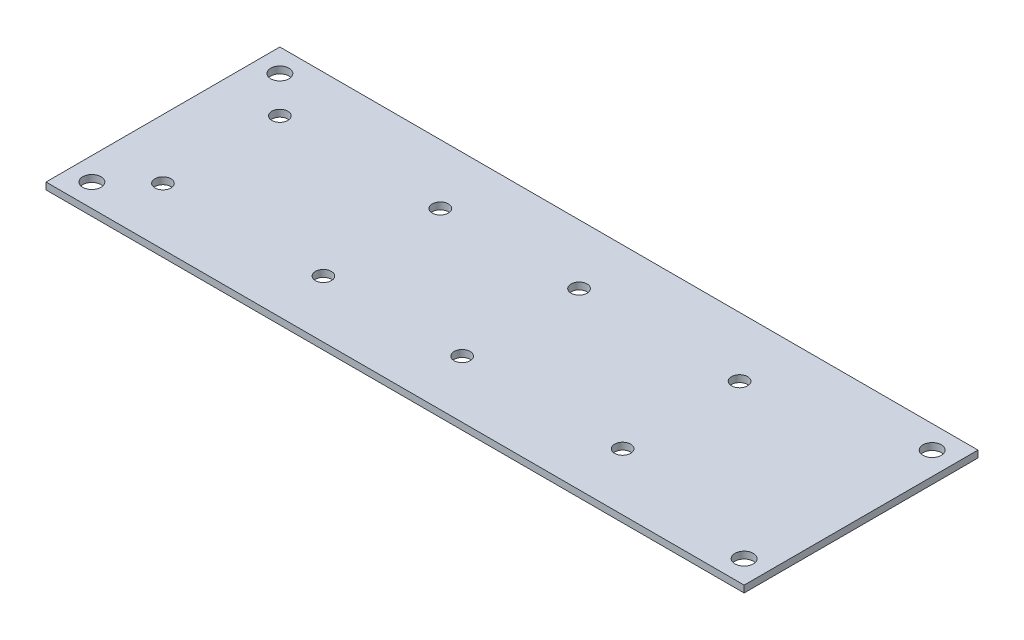
ISO-10303-21;
HEADER;
FILE_DESCRIPTION(('STEP AP214'),'2;1');
FILE_NAME('part.step','',(''),(''),'','','');
FILE_SCHEMA(('AUTOMOTIVE_DESIGN { 1 0 10303 214 1 1 1 1 }'));
ENDSEC;
DATA;
#1=APPLICATION_CONTEXT('core data for automotive mechanical design processes');
#2=APPLICATION_PROTOCOL_DEFINITION('international standard','automotive_design',2000,#1);
#3=PRODUCT_CONTEXT('',#1,'mechanical');
#4=PRODUCT('Part','Part','',(#3));
#5=PRODUCT_RELATED_PRODUCT_CATEGORY('part','',(#4));
#6=PRODUCT_DEFINITION_FORMATION('','',#4);
#7=PRODUCT_DEFINITION_CONTEXT('part definition',#1,'design');
#8=PRODUCT_DEFINITION('design','',#6,#7);
#9=PRODUCT_DEFINITION_SHAPE('','',#8);
#10=(LENGTH_UNIT() NAMED_UNIT(*) SI_UNIT(.MILLI.,.METRE.));
#11=(NAMED_UNIT(*) PLANE_ANGLE_UNIT() SI_UNIT($,.RADIAN.));
#12=(NAMED_UNIT(*) SI_UNIT($,.STERADIAN.) SOLID_ANGLE_UNIT());
#13=UNCERTAINTY_MEASURE_WITH_UNIT(LENGTH_MEASURE(1.E-05),#10,'distance_accuracy_value','');
#14=(GEOMETRIC_REPRESENTATION_CONTEXT(3) GLOBAL_UNCERTAINTY_ASSIGNED_CONTEXT((#13)) GLOBAL_UNIT_ASSIGNED_CONTEXT((#10,
#11,#12)) REPRESENTATION_CONTEXT('',''));
#15=CARTESIAN_POINT('',(0.,0.,0.));
#16=DIRECTION('',(0.,0.,1.));
#17=DIRECTION('',(1.,0.,0.));
#18=AXIS2_PLACEMENT_3D('',#15,#16,#17);
#19=CARTESIAN_POINT('',(76.125,-1.5,25.5));
#20=DIRECTION('',(1.,0.,0.));
#21=DIRECTION('',(0.,0.,-1.));
#22=AXIS2_PLACEMENT_3D('',#19,#20,#21);
#23=PLANE('',#22);
#24=DIRECTION('',(0.,0.,-1.));
#25=VECTOR('',#24,1.);
#26=CARTESIAN_POINT('',(76.125,0.,25.5));
#27=LINE('',#26,#25);
#28=CARTESIAN_POINT('',(76.125,0.,25.5));
#29=VERTEX_POINT('',#28);
#30=CARTESIAN_POINT('',(76.125,0.,-25.5));
#31=VERTEX_POINT('',#30);
#32=EDGE_CURVE('E102',#29,#31,#27,.T.);
#33=ORIENTED_EDGE('',*,*,#32,.F.);
#34=DIRECTION('',(0.,1.,0.));
#35=VECTOR('',#34,1.);
#36=CARTESIAN_POINT('',(76.125,-1.5,25.5));
#37=LINE('',#36,#35);
#38=CARTESIAN_POINT('',(76.125,-1.5,25.5));
#39=VERTEX_POINT('',#38);
#40=EDGE_CURVE('E11',#39,#29,#37,.T.);
#41=ORIENTED_EDGE('',*,*,#40,.F.);
#42=DIRECTION('',(0.,0.,-1.));
#43=VECTOR('',#42,1.);
#44=CARTESIAN_POINT('',(76.125,-1.5,25.5));
#45=LINE('',#44,#43);
#46=CARTESIAN_POINT('',(76.125,-1.5,-25.5));
#47=VERTEX_POINT('',#46);
#48=EDGE_CURVE('E95',#39,#47,#45,.T.);
#49=ORIENTED_EDGE('',*,*,#48,.T.);
#50=DIRECTION('',(0.,1.,0.));
#51=VECTOR('',#50,1.);
#52=CARTESIAN_POINT('',(76.125,-1.5,-25.5));
#53=LINE('',#52,#51);
#54=EDGE_CURVE('E40',#47,#31,#53,.T.);
#55=ORIENTED_EDGE('',*,*,#54,.T.);
#56=EDGE_LOOP('',(#33,#41,#49,#55));
#57=FACE_BOUND('',#56,.T.);
#58=ADVANCED_FACE('F37',(#57),#23,.T.);
#59=CARTESIAN_POINT('',(-76.125,-1.5,25.5));
#60=DIRECTION('',(0.,0.,1.));
#61=DIRECTION('',(1.,0.,0.));
#62=AXIS2_PLACEMENT_3D('',#59,#60,#61);
#63=PLANE('',#62);
#64=DIRECTION('',(1.,0.,0.));
#65=VECTOR('',#64,1.);
#66=CARTESIAN_POINT('',(-76.125,0.,25.5));
#67=LINE('',#66,#65);
#68=CARTESIAN_POINT('',(-76.125,0.,25.5));
#69=VERTEX_POINT('',#68);
#70=EDGE_CURVE('E97',#69,#29,#67,.T.);
#71=ORIENTED_EDGE('',*,*,#70,.F.);
#72=DIRECTION('',(0.,1.,0.));
#73=VECTOR('',#72,1.);
#74=CARTESIAN_POINT('',(-76.125,-1.5,25.5));
#75=LINE('',#74,#73);
#76=CARTESIAN_POINT('',(-76.125,-1.5,25.5));
#77=VERTEX_POINT('',#76);
#78=EDGE_CURVE('E46',#77,#69,#75,.T.);
#79=ORIENTED_EDGE('',*,*,#78,.F.);
#80=DIRECTION('',(1.,0.,0.));
#81=VECTOR('',#80,1.);
#82=CARTESIAN_POINT('',(-76.125,-1.5,25.5));
#83=LINE('',#82,#81);
#84=EDGE_CURVE('E92',#77,#39,#83,.T.);
#85=ORIENTED_EDGE('',*,*,#84,.T.);
#86=ORIENTED_EDGE('',*,*,#40,.T.);
#87=EDGE_LOOP('',(#71,#79,#85,#86));
#88=FACE_BOUND('',#87,.T.);
#89=ADVANCED_FACE('F113',(#88),#63,.T.);
#90=CARTESIAN_POINT('',(-76.125,-1.5,25.5));
#91=DIRECTION('',(-1.,0.,0.));
#92=DIRECTION('',(0.,0.,1.));
#93=AXIS2_PLACEMENT_3D('',#90,#91,#92);
#94=PLANE('',#93);
#95=DIRECTION('',(0.,0.,1.));
#96=VECTOR('',#95,1.);
#97=CARTESIAN_POINT('',(-76.125,0.,25.5));
#98=LINE('',#97,#96);
#99=CARTESIAN_POINT('',(-76.125,0.,-25.5));
#100=VERTEX_POINT('',#99);
#101=EDGE_CURVE('E87',#100,#69,#98,.T.);
#102=ORIENTED_EDGE('',*,*,#101,.F.);
#103=DIRECTION('',(0.,1.,0.));
#104=VECTOR('',#103,1.);
#105=CARTESIAN_POINT('',(-76.125,-1.5,-25.5));
#106=LINE('',#105,#104);
#107=CARTESIAN_POINT('',(-76.125,-1.5,-25.5));
#108=VERTEX_POINT('',#107);
#109=EDGE_CURVE('E82',#108,#100,#106,.T.);
#110=ORIENTED_EDGE('',*,*,#109,.F.);
#111=DIRECTION('',(0.,0.,1.));
#112=VECTOR('',#111,1.);
#113=CARTESIAN_POINT('',(-76.125,-1.5,25.5));
#114=LINE('',#113,#112);
#115=EDGE_CURVE('E85',#108,#77,#114,.T.);
#116=ORIENTED_EDGE('',*,*,#115,.T.);
#117=ORIENTED_EDGE('',*,*,#78,.T.);
#118=EDGE_LOOP('',(#102,#110,#116,#117));
#119=FACE_BOUND('',#118,.T.);
#120=ADVANCED_FACE('F84',(#119),#94,.T.);
#121=CARTESIAN_POINT('',(-76.125,-1.5,-25.5));
#122=DIRECTION('',(0.,0.,-1.));
#123=DIRECTION('',(-1.,0.,0.));
#124=AXIS2_PLACEMENT_3D('',#121,#122,#123);
#125=PLANE('',#124);
#126=DIRECTION('',(-1.,0.,0.));
#127=VECTOR('',#126,1.);
#128=CARTESIAN_POINT('',(-76.125,0.,-25.5));
#129=LINE('',#128,#127);
#130=EDGE_CURVE('E105',#31,#100,#129,.T.);
#131=ORIENTED_EDGE('',*,*,#130,.F.);
#132=ORIENTED_EDGE('',*,*,#54,.F.);
#133=DIRECTION('',(-1.,0.,0.));
#134=VECTOR('',#133,1.);
#135=CARTESIAN_POINT('',(-76.125,-1.5,-25.5));
#136=LINE('',#135,#134);
#137=EDGE_CURVE('E91',#47,#108,#136,.T.);
#138=ORIENTED_EDGE('',*,*,#137,.T.);
#139=ORIENTED_EDGE('',*,*,#109,.T.);
#140=EDGE_LOOP('',(#131,#132,#138,#139));
#141=FACE_BOUND('',#140,.T.);
#142=ADVANCED_FACE('F94',(#141),#125,.T.);
#143=CARTESIAN_POINT('',(0.,-1.5,0.));
#144=DIRECTION('',(0.,-1.,0.));
#145=DIRECTION('',(0.,0.,-1.));
#146=AXIS2_PLACEMENT_3D('',#143,#144,#145);
#147=PLANE('',#146);
#148=CARTESIAN_POINT('',(-71.125,-1.5,20.5));
#149=DIRECTION('',(0.,1.,0.));
#150=DIRECTION('',(0.,0.,1.));
#151=AXIS2_PLACEMENT_3D('',#148,#149,#150);
#152=CIRCLE('',#151,2.);
#153=CARTESIAN_POINT('',(-71.125,-1.5,22.5));
#154=VERTEX_POINT('',#153);
#155=EDGE_CURVE('E186',#154,#154,#152,.T.);
#156=ORIENTED_EDGE('',*,*,#155,.T.);
#157=EDGE_LOOP('',(#156));
#158=FACE_BOUND('',#157,.T.);
#159=CARTESIAN_POINT('',(-71.125,-1.5,-20.5));
#160=DIRECTION('',(0.,1.,0.));
#161=DIRECTION('',(0.,0.,1.));
#162=AXIS2_PLACEMENT_3D('',#159,#160,#161);
#163=CIRCLE('',#162,2.);
#164=CARTESIAN_POINT('',(-71.125,-1.5,-18.5));
#165=VERTEX_POINT('',#164);
#166=EDGE_CURVE('E194',#165,#165,#163,.T.);
#167=ORIENTED_EDGE('',*,*,#166,.T.);
#168=EDGE_LOOP('',(#167));
#169=FACE_BOUND('',#168,.T.);
#170=CARTESIAN_POINT('',(71.125,-1.5,20.5));
#171=DIRECTION('',(0.,1.,0.));
#172=DIRECTION('',(0.,0.,1.));
#173=AXIS2_PLACEMENT_3D('',#170,#171,#172);
#174=CIRCLE('',#173,2.);
#175=CARTESIAN_POINT('',(71.125,-1.5,22.5));
#176=VERTEX_POINT('',#175);
#177=EDGE_CURVE('E200',#176,#176,#174,.T.);
#178=ORIENTED_EDGE('',*,*,#177,.T.);
#179=EDGE_LOOP('',(#178));
#180=FACE_BOUND('',#179,.T.);
#181=CARTESIAN_POINT('',(71.125,-1.5,-20.5));
#182=DIRECTION('',(0.,1.,0.));
#183=DIRECTION('',(0.,0.,1.));
#184=AXIS2_PLACEMENT_3D('',#181,#182,#183);
#185=CIRCLE('',#184,2.);
#186=CARTESIAN_POINT('',(71.125,-1.5,-18.5));
#187=VERTEX_POINT('',#186);
#188=EDGE_CURVE('E206',#187,#187,#185,.T.);
#189=ORIENTED_EDGE('',*,*,#188,.T.);
#190=EDGE_LOOP('',(#189));
#191=FACE_BOUND('',#190,.T.);
#192=CARTESIAN_POINT('',(2.125,-1.5,13.));
#193=DIRECTION('',(0.,1.,0.));
#194=DIRECTION('',(0.,0.,1.));
#195=AXIS2_PLACEMENT_3D('',#192,#193,#194);
#196=CIRCLE('',#195,1.75);
#197=CARTESIAN_POINT('',(2.125,-1.5,14.75));
#198=VERTEX_POINT('',#197);
#199=EDGE_CURVE('E212',#198,#198,#196,.T.);
#200=ORIENTED_EDGE('',*,*,#199,.T.);
#201=EDGE_LOOP('',(#200));
#202=FACE_BOUND('',#201,.T.);
#203=CARTESIAN_POINT('',(37.125,-1.5,13.));
#204=DIRECTION('',(0.,1.,0.));
#205=DIRECTION('',(0.,0.,1.));
#206=AXIS2_PLACEMENT_3D('',#203,#204,#205);
#207=CIRCLE('',#206,1.75);
#208=CARTESIAN_POINT('',(37.125,-1.5,14.75));
#209=VERTEX_POINT('',#208);
#210=EDGE_CURVE('E218',#209,#209,#207,.T.);
#211=ORIENTED_EDGE('',*,*,#210,.T.);
#212=EDGE_LOOP('',(#211));
#213=FACE_BOUND('',#212,.T.);
#214=CARTESIAN_POINT('',(37.125,-1.5,-12.5));
#215=DIRECTION('',(0.,1.,0.));
#216=DIRECTION('',(0.,0.,1.));
#217=AXIS2_PLACEMENT_3D('',#214,#215,#216);
#218=CIRCLE('',#217,1.75);
#219=CARTESIAN_POINT('',(37.125,-1.5,-10.75));
#220=VERTEX_POINT('',#219);
#221=EDGE_CURVE('E224',#220,#220,#218,.T.);
#222=ORIENTED_EDGE('',*,*,#221,.T.);
#223=EDGE_LOOP('',(#222));
#224=FACE_BOUND('',#223,.T.);
#225=CARTESIAN_POINT('',(2.125,-1.5,-12.5));
#226=DIRECTION('',(0.,1.,0.));
#227=DIRECTION('',(0.,0.,1.));
#228=AXIS2_PLACEMENT_3D('',#225,#226,#227);
#229=CIRCLE('',#228,1.75);
#230=CARTESIAN_POINT('',(2.125,-1.5,-10.75));
#231=VERTEX_POINT('',#230);
#232=EDGE_CURVE('E230',#231,#231,#229,.T.);
#233=ORIENTED_EDGE('',*,*,#232,.T.);
#234=EDGE_LOOP('',(#233));
#235=FACE_BOUND('',#234,.T.);
#236=CARTESIAN_POINT('',(-28.125,-1.5,13.));
#237=DIRECTION('',(0.,1.,0.));
#238=DIRECTION('',(0.,0.,1.));
#239=AXIS2_PLACEMENT_3D('',#236,#237,#238);
#240=CIRCLE('',#239,1.75);
#241=CARTESIAN_POINT('',(-28.125,-1.5,14.75));
#242=VERTEX_POINT('',#241);
#243=EDGE_CURVE('E236',#242,#242,#240,.T.);
#244=ORIENTED_EDGE('',*,*,#243,.T.);
#245=EDGE_LOOP('',(#244));
#246=FACE_BOUND('',#245,.T.);
#247=CARTESIAN_POINT('',(-28.125,-1.5,-12.5));
#248=DIRECTION('',(0.,1.,0.));
#249=DIRECTION('',(0.,0.,1.));
#250=AXIS2_PLACEMENT_3D('',#247,#248,#249);
#251=CIRCLE('',#250,1.75);
#252=CARTESIAN_POINT('',(-28.125,-1.5,-10.75));
#253=VERTEX_POINT('',#252);
#254=EDGE_CURVE('E242',#253,#253,#251,.T.);
#255=ORIENTED_EDGE('',*,*,#254,.T.);
#256=EDGE_LOOP('',(#255));
#257=FACE_BOUND('',#256,.T.);
#258=CARTESIAN_POINT('',(-63.125,-1.5,13.));
#259=DIRECTION('',(0.,1.,0.));
#260=DIRECTION('',(0.,0.,1.));
#261=AXIS2_PLACEMENT_3D('',#258,#259,#260);
#262=CIRCLE('',#261,1.75);
#263=CARTESIAN_POINT('',(-63.125,-1.5,14.75));
#264=VERTEX_POINT('',#263);
#265=EDGE_CURVE('E248',#264,#264,#262,.T.);
#266=ORIENTED_EDGE('',*,*,#265,.T.);
#267=EDGE_LOOP('',(#266));
#268=FACE_BOUND('',#267,.T.);
#269=CARTESIAN_POINT('',(-63.125,-1.5,-12.5));
#270=DIRECTION('',(0.,1.,0.));
#271=DIRECTION('',(0.,0.,1.));
#272=AXIS2_PLACEMENT_3D('',#269,#270,#271);
#273=CIRCLE('',#272,1.75);
#274=CARTESIAN_POINT('',(-63.125,-1.5,-10.75));
#275=VERTEX_POINT('',#274);
#276=EDGE_CURVE('E106',#275,#275,#273,.T.);
#277=ORIENTED_EDGE('',*,*,#276,.T.);
#278=EDGE_LOOP('',(#277));
#279=FACE_BOUND('',#278,.T.);
#280=ORIENTED_EDGE('',*,*,#48,.F.);
#281=ORIENTED_EDGE('',*,*,#84,.F.);
#282=ORIENTED_EDGE('',*,*,#115,.F.);
#283=ORIENTED_EDGE('',*,*,#137,.F.);
#284=EDGE_LOOP('',(#280,#281,#282,#283));
#285=FACE_BOUND('',#284,.T.);
#286=ADVANCED_FACE('F90',(#158,#169,#180,#191,#202,#213,#224,#235,#246,#257,#268,#279,#285),
#147,.T.);
#287=CARTESIAN_POINT('',(0.,0.,0.));
#288=DIRECTION('',(0.,-1.,0.));
#289=DIRECTION('',(0.,0.,-1.));
#290=AXIS2_PLACEMENT_3D('',#287,#288,#289);
#291=PLANE('',#290);
#292=CARTESIAN_POINT('',(-71.125,0.,20.5));
#293=DIRECTION('',(0.,1.,0.));
#294=DIRECTION('',(0.,0.,1.));
#295=AXIS2_PLACEMENT_3D('',#292,#293,#294);
#296=CIRCLE('',#295,2.);
#297=CARTESIAN_POINT('',(-71.125,0.,22.5));
#298=VERTEX_POINT('',#297);
#299=EDGE_CURVE('E189',#298,#298,#296,.T.);
#300=ORIENTED_EDGE('',*,*,#299,.F.);
#301=EDGE_LOOP('',(#300));
#302=FACE_BOUND('',#301,.T.);
#303=CARTESIAN_POINT('',(-71.125,0.,-20.5));
#304=DIRECTION('',(0.,1.,0.));
#305=DIRECTION('',(0.,0.,1.));
#306=AXIS2_PLACEMENT_3D('',#303,#304,#305);
#307=CIRCLE('',#306,2.);
#308=CARTESIAN_POINT('',(-71.125,0.,-18.5));
#309=VERTEX_POINT('',#308);
#310=EDGE_CURVE('E191',#309,#309,#307,.T.);
#311=ORIENTED_EDGE('',*,*,#310,.F.);
#312=EDGE_LOOP('',(#311));
#313=FACE_BOUND('',#312,.T.);
#314=CARTESIAN_POINT('',(71.125,0.,20.5));
#315=DIRECTION('',(0.,1.,0.));
#316=DIRECTION('',(0.,0.,1.));
#317=AXIS2_PLACEMENT_3D('',#314,#315,#316);
#318=CIRCLE('',#317,2.);
#319=CARTESIAN_POINT('',(71.125,0.,22.5));
#320=VERTEX_POINT('',#319);
#321=EDGE_CURVE('E197',#320,#320,#318,.T.);
#322=ORIENTED_EDGE('',*,*,#321,.F.);
#323=EDGE_LOOP('',(#322));
#324=FACE_BOUND('',#323,.T.);
#325=CARTESIAN_POINT('',(71.125,0.,-20.5));
#326=DIRECTION('',(0.,1.,0.));
#327=DIRECTION('',(0.,0.,1.));
#328=AXIS2_PLACEMENT_3D('',#325,#326,#327);
#329=CIRCLE('',#328,2.);
#330=CARTESIAN_POINT('',(71.125,0.,-18.5));
#331=VERTEX_POINT('',#330);
#332=EDGE_CURVE('E203',#331,#331,#329,.T.);
#333=ORIENTED_EDGE('',*,*,#332,.F.);
#334=EDGE_LOOP('',(#333));
#335=FACE_BOUND('',#334,.T.);
#336=CARTESIAN_POINT('',(2.125,0.,13.));
#337=DIRECTION('',(0.,1.,0.));
#338=DIRECTION('',(0.,0.,1.));
#339=AXIS2_PLACEMENT_3D('',#336,#337,#338);
#340=CIRCLE('',#339,1.75);
#341=CARTESIAN_POINT('',(2.125,0.,14.75));
#342=VERTEX_POINT('',#341);
#343=EDGE_CURVE('E209',#342,#342,#340,.T.);
#344=ORIENTED_EDGE('',*,*,#343,.F.);
#345=EDGE_LOOP('',(#344));
#346=FACE_BOUND('',#345,.T.);
#347=CARTESIAN_POINT('',(37.125,0.,13.));
#348=DIRECTION('',(0.,1.,0.));
#349=DIRECTION('',(0.,0.,1.));
#350=AXIS2_PLACEMENT_3D('',#347,#348,#349);
#351=CIRCLE('',#350,1.75);
#352=CARTESIAN_POINT('',(37.125,0.,14.75));
#353=VERTEX_POINT('',#352);
#354=EDGE_CURVE('E215',#353,#353,#351,.T.);
#355=ORIENTED_EDGE('',*,*,#354,.F.);
#356=EDGE_LOOP('',(#355));
#357=FACE_BOUND('',#356,.T.);
#358=CARTESIAN_POINT('',(37.125,0.,-12.5));
#359=DIRECTION('',(0.,1.,0.));
#360=DIRECTION('',(0.,0.,1.));
#361=AXIS2_PLACEMENT_3D('',#358,#359,#360);
#362=CIRCLE('',#361,1.75);
#363=CARTESIAN_POINT('',(37.125,0.,-10.75));
#364=VERTEX_POINT('',#363);
#365=EDGE_CURVE('E221',#364,#364,#362,.T.);
#366=ORIENTED_EDGE('',*,*,#365,.F.);
#367=EDGE_LOOP('',(#366));
#368=FACE_BOUND('',#367,.T.);
#369=CARTESIAN_POINT('',(2.125,0.,-12.5));
#370=DIRECTION('',(0.,1.,0.));
#371=DIRECTION('',(0.,0.,1.));
#372=AXIS2_PLACEMENT_3D('',#369,#370,#371);
#373=CIRCLE('',#372,1.75);
#374=CARTESIAN_POINT('',(2.125,0.,-10.75));
#375=VERTEX_POINT('',#374);
#376=EDGE_CURVE('E227',#375,#375,#373,.T.);
#377=ORIENTED_EDGE('',*,*,#376,.F.);
#378=EDGE_LOOP('',(#377));
#379=FACE_BOUND('',#378,.T.);
#380=CARTESIAN_POINT('',(-28.125,0.,13.));
#381=DIRECTION('',(0.,1.,0.));
#382=DIRECTION('',(0.,0.,1.));
#383=AXIS2_PLACEMENT_3D('',#380,#381,#382);
#384=CIRCLE('',#383,1.75);
#385=CARTESIAN_POINT('',(-28.125,0.,14.75));
#386=VERTEX_POINT('',#385);
#387=EDGE_CURVE('E233',#386,#386,#384,.T.);
#388=ORIENTED_EDGE('',*,*,#387,.F.);
#389=EDGE_LOOP('',(#388));
#390=FACE_BOUND('',#389,.T.);
#391=CARTESIAN_POINT('',(-28.125,0.,-12.5));
#392=DIRECTION('',(0.,1.,0.));
#393=DIRECTION('',(0.,0.,1.));
#394=AXIS2_PLACEMENT_3D('',#391,#392,#393);
#395=CIRCLE('',#394,1.75);
#396=CARTESIAN_POINT('',(-28.125,0.,-10.75));
#397=VERTEX_POINT('',#396);
#398=EDGE_CURVE('E239',#397,#397,#395,.T.);
#399=ORIENTED_EDGE('',*,*,#398,.F.);
#400=EDGE_LOOP('',(#399));
#401=FACE_BOUND('',#400,.T.);
#402=CARTESIAN_POINT('',(-63.125,0.,13.));
#403=DIRECTION('',(0.,1.,0.));
#404=DIRECTION('',(0.,0.,1.));
#405=AXIS2_PLACEMENT_3D('',#402,#403,#404);
#406=CIRCLE('',#405,1.75);
#407=CARTESIAN_POINT('',(-63.125,0.,14.75));
#408=VERTEX_POINT('',#407);
#409=EDGE_CURVE('E245',#408,#408,#406,.T.);
#410=ORIENTED_EDGE('',*,*,#409,.F.);
#411=EDGE_LOOP('',(#410));
#412=FACE_BOUND('',#411,.T.);
#413=CARTESIAN_POINT('',(-63.125,0.,-12.5));
#414=DIRECTION('',(0.,1.,0.));
#415=DIRECTION('',(0.,0.,1.));
#416=AXIS2_PLACEMENT_3D('',#413,#414,#415);
#417=CIRCLE('',#416,1.75);
#418=CARTESIAN_POINT('',(-63.125,0.,-10.75));
#419=VERTEX_POINT('',#418);
#420=EDGE_CURVE('E251',#419,#419,#417,.T.);
#421=ORIENTED_EDGE('',*,*,#420,.F.);
#422=EDGE_LOOP('',(#421));
#423=FACE_BOUND('',#422,.T.);
#424=ORIENTED_EDGE('',*,*,#32,.T.);
#425=ORIENTED_EDGE('',*,*,#130,.T.);
#426=ORIENTED_EDGE('',*,*,#101,.T.);
#427=ORIENTED_EDGE('',*,*,#70,.T.);
#428=EDGE_LOOP('',(#424,#425,#426,#427));
#429=FACE_BOUND('',#428,.T.);
#430=ADVANCED_FACE('F112',(#302,#313,#324,#335,#346,#357,#368,#379,#390,#401,#412,#423,#429),
#291,.F.);
#431=CARTESIAN_POINT('',(-63.125,-1.5,-12.5));
#432=DIRECTION('',(0.,1.,0.));
#433=DIRECTION('',(0.,0.,1.));
#434=AXIS2_PLACEMENT_3D('',#431,#432,#433);
#435=CYLINDRICAL_SURFACE('',#434,1.75);
#436=ORIENTED_EDGE('',*,*,#276,.F.);
#437=EDGE_LOOP('',(#436));
#438=FACE_BOUND('',#437,.T.);
#439=ORIENTED_EDGE('',*,*,#420,.T.);
#440=EDGE_LOOP('',(#439));
#441=FACE_BOUND('',#440,.T.);
#442=ADVANCED_FACE('F131',(#438,#441),#435,.F.);
#443=CARTESIAN_POINT('',(-63.125,-1.5,13.));
#444=DIRECTION('',(0.,1.,0.));
#445=DIRECTION('',(0.,0.,1.));
#446=AXIS2_PLACEMENT_3D('',#443,#444,#445);
#447=CYLINDRICAL_SURFACE('',#446,1.75);
#448=ORIENTED_EDGE('',*,*,#265,.F.);
#449=EDGE_LOOP('',(#448));
#450=FACE_BOUND('',#449,.T.);
#451=ORIENTED_EDGE('',*,*,#409,.T.);
#452=EDGE_LOOP('',(#451));
#453=FACE_BOUND('',#452,.T.);
#454=ADVANCED_FACE('F138',(#450,#453),#447,.F.);
#455=CARTESIAN_POINT('',(-28.125,-1.5,-12.5));
#456=DIRECTION('',(0.,1.,0.));
#457=DIRECTION('',(0.,0.,1.));
#458=AXIS2_PLACEMENT_3D('',#455,#456,#457);
#459=CYLINDRICAL_SURFACE('',#458,1.75);
#460=ORIENTED_EDGE('',*,*,#254,.F.);
#461=EDGE_LOOP('',(#460));
#462=FACE_BOUND('',#461,.T.);
#463=ORIENTED_EDGE('',*,*,#398,.T.);
#464=EDGE_LOOP('',(#463));
#465=FACE_BOUND('',#464,.T.);
#466=ADVANCED_FACE('F142',(#462,#465),#459,.F.);
#467=CARTESIAN_POINT('',(-28.125,-1.5,13.));
#468=DIRECTION('',(0.,1.,0.));
#469=DIRECTION('',(0.,0.,1.));
#470=AXIS2_PLACEMENT_3D('',#467,#468,#469);
#471=CYLINDRICAL_SURFACE('',#470,1.75);
#472=ORIENTED_EDGE('',*,*,#243,.F.);
#473=EDGE_LOOP('',(#472));
#474=FACE_BOUND('',#473,.T.);
#475=ORIENTED_EDGE('',*,*,#387,.T.);
#476=EDGE_LOOP('',(#475));
#477=FACE_BOUND('',#476,.T.);
#478=ADVANCED_FACE('F146',(#474,#477),#471,.F.);
#479=CARTESIAN_POINT('',(2.125,-1.5,-12.5));
#480=DIRECTION('',(0.,1.,0.));
#481=DIRECTION('',(0.,0.,1.));
#482=AXIS2_PLACEMENT_3D('',#479,#480,#481);
#483=CYLINDRICAL_SURFACE('',#482,1.75);
#484=ORIENTED_EDGE('',*,*,#232,.F.);
#485=EDGE_LOOP('',(#484));
#486=FACE_BOUND('',#485,.T.);
#487=ORIENTED_EDGE('',*,*,#376,.T.);
#488=EDGE_LOOP('',(#487));
#489=FACE_BOUND('',#488,.T.);
#490=ADVANCED_FACE('F150',(#486,#489),#483,.F.);
#491=CARTESIAN_POINT('',(37.125,-1.5,-12.5));
#492=DIRECTION('',(0.,1.,0.));
#493=DIRECTION('',(0.,0.,1.));
#494=AXIS2_PLACEMENT_3D('',#491,#492,#493);
#495=CYLINDRICAL_SURFACE('',#494,1.75);
#496=ORIENTED_EDGE('',*,*,#221,.F.);
#497=EDGE_LOOP('',(#496));
#498=FACE_BOUND('',#497,.T.);
#499=ORIENTED_EDGE('',*,*,#365,.T.);
#500=EDGE_LOOP('',(#499));
#501=FACE_BOUND('',#500,.T.);
#502=ADVANCED_FACE('F154',(#498,#501),#495,.F.);
#503=CARTESIAN_POINT('',(37.125,-1.5,13.));
#504=DIRECTION('',(0.,1.,0.));
#505=DIRECTION('',(0.,0.,1.));
#506=AXIS2_PLACEMENT_3D('',#503,#504,#505);
#507=CYLINDRICAL_SURFACE('',#506,1.75);
#508=ORIENTED_EDGE('',*,*,#210,.F.);
#509=EDGE_LOOP('',(#508));
#510=FACE_BOUND('',#509,.T.);
#511=ORIENTED_EDGE('',*,*,#354,.T.);
#512=EDGE_LOOP('',(#511));
#513=FACE_BOUND('',#512,.T.);
#514=ADVANCED_FACE('F158',(#510,#513),#507,.F.);
#515=CARTESIAN_POINT('',(2.125,-1.5,13.));
#516=DIRECTION('',(0.,1.,0.));
#517=DIRECTION('',(0.,0.,1.));
#518=AXIS2_PLACEMENT_3D('',#515,#516,#517);
#519=CYLINDRICAL_SURFACE('',#518,1.75);
#520=ORIENTED_EDGE('',*,*,#199,.F.);
#521=EDGE_LOOP('',(#520));
#522=FACE_BOUND('',#521,.T.);
#523=ORIENTED_EDGE('',*,*,#343,.T.);
#524=EDGE_LOOP('',(#523));
#525=FACE_BOUND('',#524,.T.);
#526=ADVANCED_FACE('F162',(#522,#525),#519,.F.);
#527=CARTESIAN_POINT('',(71.125,-1.5,-20.5));
#528=DIRECTION('',(0.,1.,0.));
#529=DIRECTION('',(0.,0.,1.));
#530=AXIS2_PLACEMENT_3D('',#527,#528,#529);
#531=CYLINDRICAL_SURFACE('',#530,2.);
#532=ORIENTED_EDGE('',*,*,#188,.F.);
#533=EDGE_LOOP('',(#532));
#534=FACE_BOUND('',#533,.T.);
#535=ORIENTED_EDGE('',*,*,#332,.T.);
#536=EDGE_LOOP('',(#535));
#537=FACE_BOUND('',#536,.T.);
#538=ADVANCED_FACE('F166',(#534,#537),#531,.F.);
#539=CARTESIAN_POINT('',(71.125,-1.5,20.5));
#540=DIRECTION('',(0.,1.,0.));
#541=DIRECTION('',(0.,0.,1.));
#542=AXIS2_PLACEMENT_3D('',#539,#540,#541);
#543=CYLINDRICAL_SURFACE('',#542,2.);
#544=ORIENTED_EDGE('',*,*,#177,.F.);
#545=EDGE_LOOP('',(#544));
#546=FACE_BOUND('',#545,.T.);
#547=ORIENTED_EDGE('',*,*,#321,.T.);
#548=EDGE_LOOP('',(#547));
#549=FACE_BOUND('',#548,.T.);
#550=ADVANCED_FACE('F170',(#546,#549),#543,.F.);
#551=CARTESIAN_POINT('',(-71.125,-1.5,-20.5));
#552=DIRECTION('',(0.,1.,0.));
#553=DIRECTION('',(0.,0.,1.));
#554=AXIS2_PLACEMENT_3D('',#551,#552,#553);
#555=CYLINDRICAL_SURFACE('',#554,2.);
#556=ORIENTED_EDGE('',*,*,#166,.F.);
#557=EDGE_LOOP('',(#556));
#558=FACE_BOUND('',#557,.T.);
#559=ORIENTED_EDGE('',*,*,#310,.T.);
#560=EDGE_LOOP('',(#559));
#561=FACE_BOUND('',#560,.T.);
#562=ADVANCED_FACE('F174',(#558,#561),#555,.F.);
#563=CARTESIAN_POINT('',(-71.125,-1.5,20.5));
#564=DIRECTION('',(0.,1.,0.));
#565=DIRECTION('',(0.,0.,1.));
#566=AXIS2_PLACEMENT_3D('',#563,#564,#565);
#567=CYLINDRICAL_SURFACE('',#566,2.);
#568=ORIENTED_EDGE('',*,*,#155,.F.);
#569=EDGE_LOOP('',(#568));
#570=FACE_BOUND('',#569,.T.);
#571=ORIENTED_EDGE('',*,*,#299,.T.);
#572=EDGE_LOOP('',(#571));
#573=FACE_BOUND('',#572,.T.);
#574=ADVANCED_FACE('F178',(#570,#573),#567,.F.);
#575=CLOSED_SHELL('',(#58,#89,#120,#142,#286,#430,#442,#454,#466,#478,#490,#502,#514,#526,#538,
#550,#562,#574));
#576=MANIFOLD_SOLID_BREP('B2',#575);
#577=ADVANCED_BREP_SHAPE_REPRESENTATION('',(#18,#576),#14);
#578=SHAPE_DEFINITION_REPRESENTATION(#9,#577);
ENDSEC;
END-ISO-10303-21;
